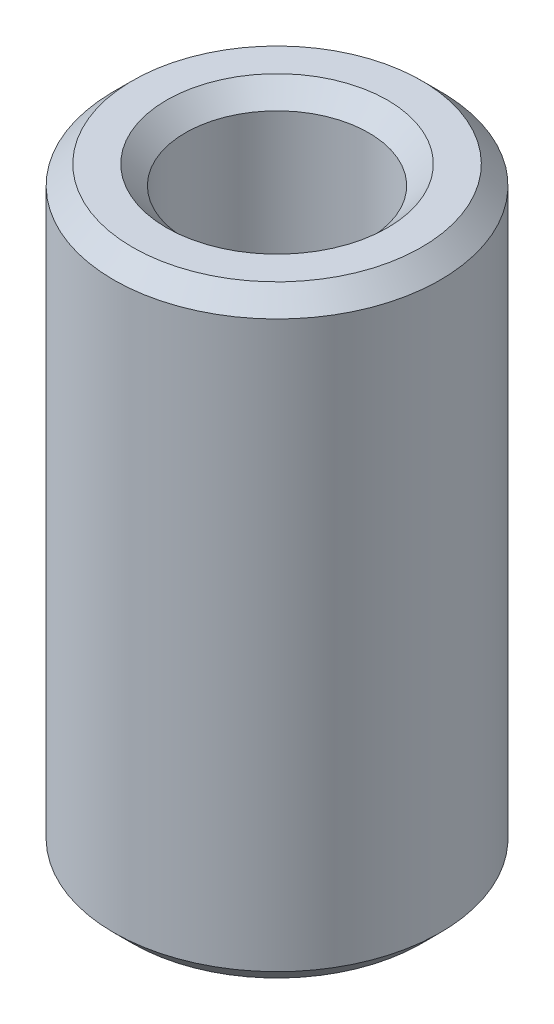
ISO-10303-21;
HEADER;
FILE_DESCRIPTION(('STEP AP214'),'2;1');
FILE_NAME('part.step','',(''),(''),'','','');
FILE_SCHEMA(('AUTOMOTIVE_DESIGN { 1 0 10303 214 1 1 1 1 }'));
ENDSEC;
DATA;
#1=APPLICATION_CONTEXT('core data for automotive mechanical design processes');
#2=APPLICATION_PROTOCOL_DEFINITION('international standard','automotive_design',2000,#1);
#3=PRODUCT_CONTEXT('',#1,'mechanical');
#4=PRODUCT('Part','Part','',(#3));
#5=PRODUCT_RELATED_PRODUCT_CATEGORY('part','',(#4));
#6=PRODUCT_DEFINITION_FORMATION('','',#4);
#7=PRODUCT_DEFINITION_CONTEXT('part definition',#1,'design');
#8=PRODUCT_DEFINITION('design','',#6,#7);
#9=PRODUCT_DEFINITION_SHAPE('','',#8);
#10=(LENGTH_UNIT() NAMED_UNIT(*) SI_UNIT(.MILLI.,.METRE.));
#11=(NAMED_UNIT(*) PLANE_ANGLE_UNIT() SI_UNIT($,.RADIAN.));
#12=(NAMED_UNIT(*) SI_UNIT($,.STERADIAN.) SOLID_ANGLE_UNIT());
#13=UNCERTAINTY_MEASURE_WITH_UNIT(LENGTH_MEASURE(1.E-05),#10,'distance_accuracy_value','');
#14=(GEOMETRIC_REPRESENTATION_CONTEXT(3) GLOBAL_UNCERTAINTY_ASSIGNED_CONTEXT((#13)) GLOBAL_UNIT_ASSIGNED_CONTEXT((#10,
#11,#12)) REPRESENTATION_CONTEXT('',''));
#15=CARTESIAN_POINT('',(0.,0.,0.));
#16=DIRECTION('',(0.,0.,1.));
#17=DIRECTION('',(1.,0.,0.));
#18=AXIS2_PLACEMENT_3D('',#15,#16,#17);
#19=CARTESIAN_POINT('',(0.,12.,0.));
#20=DIRECTION('',(0.,1.,0.));
#21=DIRECTION('',(0.,0.,1.));
#22=AXIS2_PLACEMENT_3D('',#19,#20,#21);
#23=PLANE('',#22);
#24=CARTESIAN_POINT('',(0.,12.,0.));
#25=DIRECTION('',(0.,1.,0.));
#26=DIRECTION('',(0.,0.,1.));
#27=AXIS2_PLACEMENT_3D('',#24,#25,#26);
#28=CIRCLE('',#27,4.40000000000001);
#29=CARTESIAN_POINT('',(0.,12.,4.40000000000001));
#30=VERTEX_POINT('',#29);
#31=EDGE_CURVE('E54',#30,#30,#28,.F.);
#32=ORIENTED_EDGE('',*,*,#31,.T.);
#33=EDGE_LOOP('',(#32));
#34=FACE_BOUND('',#33,.T.);
#35=CARTESIAN_POINT('',(0.,12.,0.));
#36=DIRECTION('',(0.,1.,0.));
#37=DIRECTION('',(0.,0.,1.));
#38=AXIS2_PLACEMENT_3D('',#35,#36,#37);
#39=CIRCLE('',#38,5.74999999999999);
#40=CARTESIAN_POINT('',(0.,12.,5.74999999999999));
#41=VERTEX_POINT('',#40);
#42=EDGE_CURVE('E57',#41,#41,#39,.T.);
#43=ORIENTED_EDGE('',*,*,#42,.T.);
#44=EDGE_LOOP('',(#43));
#45=FACE_BOUND('',#44,.T.);
#46=ADVANCED_FACE('F33',(#34,#45),#23,.T.);
#47=CARTESIAN_POINT('',(0.,-12.,0.));
#48=DIRECTION('',(0.,1.,0.));
#49=DIRECTION('',(0.,0.,1.));
#50=AXIS2_PLACEMENT_3D('',#47,#48,#49);
#51=PLANE('',#50);
#52=CARTESIAN_POINT('',(0.,-12.,0.));
#53=DIRECTION('',(0.,1.,0.));
#54=DIRECTION('',(0.,0.,1.));
#55=AXIS2_PLACEMENT_3D('',#52,#53,#54);
#56=CIRCLE('',#55,4.4);
#57=CARTESIAN_POINT('',(0.,-12.,4.4));
#58=VERTEX_POINT('',#57);
#59=EDGE_CURVE('E45',#58,#58,#56,.T.);
#60=ORIENTED_EDGE('',*,*,#59,.T.);
#61=EDGE_LOOP('',(#60));
#62=FACE_BOUND('',#61,.T.);
#63=CARTESIAN_POINT('',(0.,-12.,0.));
#64=DIRECTION('',(0.,1.,0.));
#65=DIRECTION('',(0.,0.,1.));
#66=AXIS2_PLACEMENT_3D('',#63,#64,#65);
#67=CIRCLE('',#66,5.75000000000001);
#68=CARTESIAN_POINT('',(0.,-12.,5.75));
#69=VERTEX_POINT('',#68);
#70=EDGE_CURVE('E49',#69,#69,#67,.F.);
#71=ORIENTED_EDGE('',*,*,#70,.T.);
#72=EDGE_LOOP('',(#71));
#73=FACE_BOUND('',#72,.T.);
#74=ADVANCED_FACE('F77',(#62,#73),#51,.F.);
#75=CARTESIAN_POINT('',(0.,12.,0.));
#76=DIRECTION('',(0.,-1.,0.));
#77=DIRECTION('',(0.,0.,-1.));
#78=AXIS2_PLACEMENT_3D('',#75,#76,#77);
#79=CYLINDRICAL_SURFACE('',#78,6.5);
#80=CARTESIAN_POINT('',(0.,-11.25,0.));
#81=DIRECTION('',(0.,1.,0.));
#82=DIRECTION('',(0.,0.,1.));
#83=AXIS2_PLACEMENT_3D('',#80,#81,#82);
#84=CIRCLE('',#83,6.5);
#85=CARTESIAN_POINT('',(0.,-11.25,6.5));
#86=VERTEX_POINT('',#85);
#87=EDGE_CURVE('E10',#86,#86,#84,.T.);
#88=ORIENTED_EDGE('',*,*,#87,.T.);
#89=EDGE_LOOP('',(#88));
#90=FACE_BOUND('',#89,.T.);
#91=CARTESIAN_POINT('',(0.,11.25,0.));
#92=DIRECTION('',(0.,1.,0.));
#93=DIRECTION('',(0.,0.,1.));
#94=AXIS2_PLACEMENT_3D('',#91,#92,#93);
#95=CIRCLE('',#94,6.5);
#96=CARTESIAN_POINT('',(0.,11.25,6.5));
#97=VERTEX_POINT('',#96);
#98=EDGE_CURVE('E41',#97,#97,#95,.F.);
#99=ORIENTED_EDGE('',*,*,#98,.T.);
#100=EDGE_LOOP('',(#99));
#101=FACE_BOUND('',#100,.T.);
#102=ADVANCED_FACE('F80',(#90,#101),#79,.T.);
#103=CARTESIAN_POINT('',(0.,12.,0.));
#104=DIRECTION('',(0.,-1.,0.));
#105=DIRECTION('',(0.,0.,-1.));
#106=AXIS2_PLACEMENT_3D('',#103,#104,#105);
#107=CYLINDRICAL_SURFACE('',#106,3.65);
#108=CARTESIAN_POINT('',(0.,11.25,0.));
#109=DIRECTION('',(0.,1.,0.));
#110=DIRECTION('',(0.,0.,1.));
#111=AXIS2_PLACEMENT_3D('',#108,#109,#110);
#112=CIRCLE('',#111,3.65);
#113=CARTESIAN_POINT('',(0.,11.25,3.65));
#114=VERTEX_POINT('',#113);
#115=EDGE_CURVE('E60',#114,#114,#112,.T.);
#116=ORIENTED_EDGE('',*,*,#115,.T.);
#117=EDGE_LOOP('',(#116));
#118=FACE_BOUND('',#117,.T.);
#119=CARTESIAN_POINT('',(0.,-11.25,0.));
#120=DIRECTION('',(0.,1.,0.));
#121=DIRECTION('',(0.,0.,1.));
#122=AXIS2_PLACEMENT_3D('',#119,#120,#121);
#123=CIRCLE('',#122,3.65);
#124=CARTESIAN_POINT('',(0.,-11.25,3.65));
#125=VERTEX_POINT('',#124);
#126=EDGE_CURVE('E63',#125,#125,#123,.F.);
#127=ORIENTED_EDGE('',*,*,#126,.T.);
#128=EDGE_LOOP('',(#127));
#129=FACE_BOUND('',#128,.T.);
#130=ADVANCED_FACE('F67',(#118,#129),#107,.F.);
#131=CARTESIAN_POINT('',(0.,11.25,0.));
#132=DIRECTION('',(0.,1.,0.));
#133=DIRECTION('',(0.,0.,1.));
#134=AXIS2_PLACEMENT_3D('',#131,#132,#133);
#135=CONICAL_SURFACE('',#134,3.65,0.785398163397451);
#136=ORIENTED_EDGE('',*,*,#31,.F.);
#137=EDGE_LOOP('',(#136));
#138=FACE_BOUND('',#137,.T.);
#139=ORIENTED_EDGE('',*,*,#115,.F.);
#140=EDGE_LOOP('',(#139));
#141=FACE_BOUND('',#140,.T.);
#142=ADVANCED_FACE('F73',(#138,#141),#135,.F.);
#143=CARTESIAN_POINT('',(0.,-12.,0.));
#144=DIRECTION('',(0.,-1.,0.));
#145=DIRECTION('',(0.,0.,-1.));
#146=AXIS2_PLACEMENT_3D('',#143,#144,#145);
#147=CONICAL_SURFACE('',#146,4.4,0.785398163397446);
#148=ORIENTED_EDGE('',*,*,#126,.F.);
#149=EDGE_LOOP('',(#148));
#150=FACE_BOUND('',#149,.T.);
#151=ORIENTED_EDGE('',*,*,#59,.F.);
#152=EDGE_LOOP('',(#151));
#153=FACE_BOUND('',#152,.T.);
#154=ADVANCED_FACE('F69',(#150,#153),#147,.F.);
#155=CARTESIAN_POINT('',(0.,-11.25,0.));
#156=DIRECTION('',(0.,1.,0.));
#157=DIRECTION('',(0.,0.,1.));
#158=AXIS2_PLACEMENT_3D('',#155,#156,#157);
#159=CONICAL_SURFACE('',#158,6.5,0.78539816339745);
#160=CARTESIAN_POINT('',(0.,-12.,5.75));
#161=CARTESIAN_POINT('',(0.,-11.9921875,5.7578125));
#162=CARTESIAN_POINT('',(0.,-11.984375,5.765625));
#163=CARTESIAN_POINT('',(0.,-11.96875,5.78125));
#164=CARTESIAN_POINT('',(0.,-11.9609375,5.7890625));
#165=CARTESIAN_POINT('',(0.,-11.9453125,5.8046875));
#166=CARTESIAN_POINT('',(0.,-11.9375,5.8125));
#167=CARTESIAN_POINT('',(0.,-11.921875,5.828125));
#168=CARTESIAN_POINT('',(0.,-11.9140625,5.8359375));
#169=CARTESIAN_POINT('',(0.,-11.8984375,5.8515625));
#170=CARTESIAN_POINT('',(0.,-11.890625,5.859375));
#171=CARTESIAN_POINT('',(0.,-11.875,5.875));
#172=CARTESIAN_POINT('',(0.,-11.8671875,5.8828125));
#173=CARTESIAN_POINT('',(0.,-11.8515625,5.8984375));
#174=CARTESIAN_POINT('',(0.,-11.84375,5.90625));
#175=CARTESIAN_POINT('',(0.,-11.828125,5.921875));
#176=CARTESIAN_POINT('',(0.,-11.8203125,5.9296875));
#177=CARTESIAN_POINT('',(0.,-11.8046875,5.9453125));
#178=CARTESIAN_POINT('',(0.,-11.796875,5.953125));
#179=CARTESIAN_POINT('',(0.,-11.78125,5.96875));
#180=CARTESIAN_POINT('',(0.,-11.7734375,5.9765625));
#181=CARTESIAN_POINT('',(0.,-11.7578125,5.9921875));
#182=CARTESIAN_POINT('',(0.,-11.75,6.));
#183=CARTESIAN_POINT('',(0.,-11.734375,6.015625));
#184=CARTESIAN_POINT('',(0.,-11.7265625,6.0234375));
#185=CARTESIAN_POINT('',(0.,-11.7109375,6.0390625));
#186=CARTESIAN_POINT('',(0.,-11.703125,6.046875));
#187=CARTESIAN_POINT('',(0.,-11.6875,6.0625));
#188=CARTESIAN_POINT('',(0.,-11.6796875,6.0703125));
#189=CARTESIAN_POINT('',(0.,-11.6640625,6.0859375));
#190=CARTESIAN_POINT('',(0.,-11.65625,6.09375));
#191=CARTESIAN_POINT('',(0.,-11.640625,6.109375));
#192=CARTESIAN_POINT('',(0.,-11.6328125,6.1171875));
#193=CARTESIAN_POINT('',(0.,-11.6171875,6.1328125));
#194=CARTESIAN_POINT('',(0.,-11.609375,6.140625));
#195=CARTESIAN_POINT('',(0.,-11.59375,6.15625));
#196=CARTESIAN_POINT('',(0.,-11.5859375,6.1640625));
#197=CARTESIAN_POINT('',(0.,-11.5703125,6.1796875));
#198=CARTESIAN_POINT('',(0.,-11.5625,6.1875));
#199=CARTESIAN_POINT('',(0.,-11.546875,6.203125));
#200=CARTESIAN_POINT('',(0.,-11.5390625,6.2109375));
#201=CARTESIAN_POINT('',(0.,-11.5234375,6.2265625));
#202=CARTESIAN_POINT('',(0.,-11.515625,6.234375));
#203=CARTESIAN_POINT('',(0.,-11.5,6.25));
#204=CARTESIAN_POINT('',(0.,-11.4921875,6.2578125));
#205=CARTESIAN_POINT('',(0.,-11.4765625,6.2734375));
#206=CARTESIAN_POINT('',(0.,-11.46875,6.28125));
#207=CARTESIAN_POINT('',(0.,-11.453125,6.296875));
#208=CARTESIAN_POINT('',(0.,-11.4453125,6.3046875));
#209=CARTESIAN_POINT('',(0.,-11.4296875,6.3203125));
#210=CARTESIAN_POINT('',(0.,-11.421875,6.328125));
#211=CARTESIAN_POINT('',(0.,-11.40625,6.34375));
#212=CARTESIAN_POINT('',(0.,-11.3984375,6.3515625));
#213=CARTESIAN_POINT('',(0.,-11.3828125,6.3671875));
#214=CARTESIAN_POINT('',(0.,-11.375,6.375));
#215=CARTESIAN_POINT('',(0.,-11.359375,6.390625));
#216=CARTESIAN_POINT('',(0.,-11.3515625,6.3984375));
#217=CARTESIAN_POINT('',(0.,-11.3359375,6.4140625));
#218=CARTESIAN_POINT('',(0.,-11.328125,6.421875));
#219=CARTESIAN_POINT('',(0.,-11.3125,6.4375));
#220=CARTESIAN_POINT('',(0.,-11.3046875,6.4453125));
#221=CARTESIAN_POINT('',(0.,-11.2890625,6.4609375));
#222=CARTESIAN_POINT('',(0.,-11.28125,6.46875));
#223=CARTESIAN_POINT('',(0.,-11.265625,6.484375));
#224=CARTESIAN_POINT('',(0.,-11.2578125,6.4921875));
#225=CARTESIAN_POINT('',(0.,-11.25,6.5));
#226=B_SPLINE_CURVE_WITH_KNOTS('',3,(#160,#161,#162,#163,#164,#165,#166,#167,#168,#169,#170,
#171,#172,#173,#174,#175,#176,#177,#178,#179,#180,#181,#182,#183,#184,#185,#186,#187,#188,#189,
#190,#191,#192,#193,#194,#195,#196,#197,#198,#199,#200,#201,#202,#203,#204,#205,#206,#207,#208,
#209,#210,#211,#212,#213,#214,#215,#216,#217,#218,#219,#220,#221,#222,#223,#224,#225),
.UNSPECIFIED.,.F.,.F.,(4,2,2,2,2,2,2,2,2,2,2,2,2,2,2,2,2,2,2,2,2,2,2,2,2,2,2,2,2,2,2,2,4),(0.,
0.0331456303681201,0.0662912607362383,0.0994368911043583,0.132582521472477,0.165728151840596,
0.198873782208716,0.232019412576834,0.265165042944953,0.298310673313073,0.331456303681192,
0.364601934049312,0.397747564417431,0.430893194785549,0.464038825153669,0.497184455521788,
0.530330085889907,0.563475716258027,0.596621346626145,0.629766976994265,0.662912607362384,
0.696058237730503,0.729203868098623,0.762349498466742,0.795495128834861,0.82864075920298,
0.861786389571099,0.894932019939219,0.928077650307338,0.961223280675457,0.994368911043576,
1.0275145414117,1.06066017177981),.UNSPECIFIED.);
#227=EDGE_CURVE('BSEAM72',#69,#86,#226,.T.);
#228=ORIENTED_EDGE('',*,*,#70,.F.);
#229=ORIENTED_EDGE('',*,*,#87,.F.);
#230=ORIENTED_EDGE('',*,*,#227,.T.);
#231=ORIENTED_EDGE('',*,*,#227,.F.);
#232=EDGE_LOOP('',(#228,#230,#229,#231));
#233=FACE_BOUND('',#232,.T.);
#234=ADVANCED_FACE('F72',(#233),#159,.T.);
#235=CARTESIAN_POINT('',(0.,12.,0.));
#236=DIRECTION('',(0.,-1.,0.));
#237=DIRECTION('',(0.,0.,-1.));
#238=AXIS2_PLACEMENT_3D('',#235,#236,#237);
#239=CONICAL_SURFACE('',#238,5.74999999999999,0.785398163397445);
#240=ORIENTED_EDGE('',*,*,#98,.F.);
#241=EDGE_LOOP('',(#240));
#242=FACE_BOUND('',#241,.T.);
#243=ORIENTED_EDGE('',*,*,#42,.F.);
#244=EDGE_LOOP('',(#243));
#245=FACE_BOUND('',#244,.T.);
#246=ADVANCED_FACE('F36',(#242,#245),#239,.T.);
#247=CLOSED_SHELL('',(#46,#74,#102,#130,#142,#154,#234,#246));
#248=MANIFOLD_SOLID_BREP('B2',#247);
#249=ADVANCED_BREP_SHAPE_REPRESENTATION('',(#18,#248),#14);
#250=SHAPE_DEFINITION_REPRESENTATION(#9,#249);
ENDSEC;
END-ISO-10303-21;
